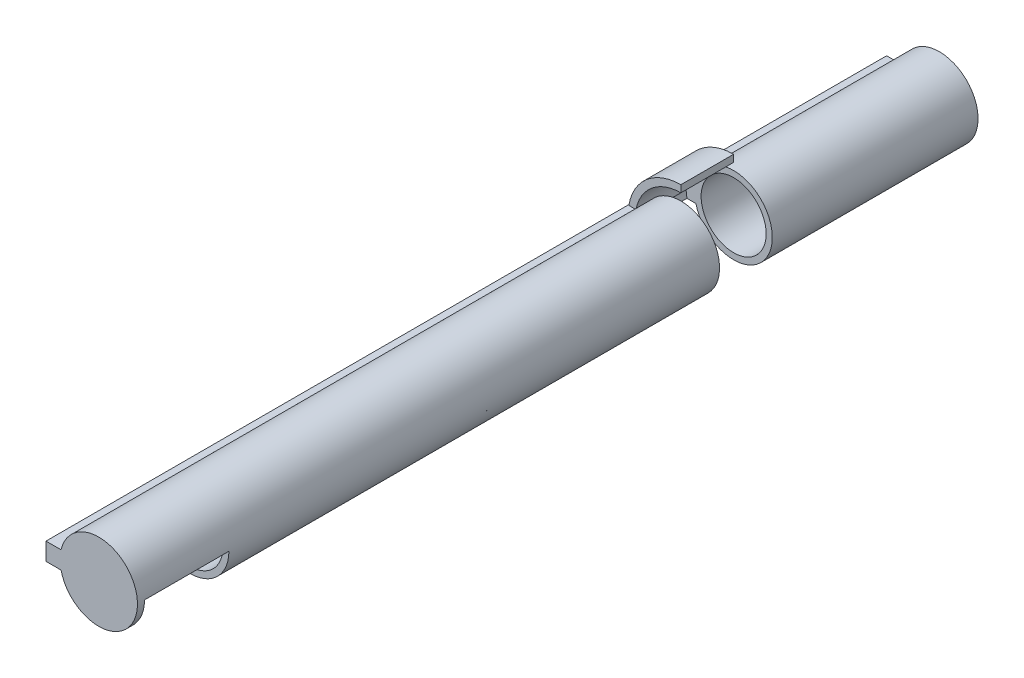
ISO-10303-21;
HEADER;
FILE_DESCRIPTION(('STEP AP214'),'2;1');
FILE_NAME('part.step','',(''),(''),'','','');
FILE_SCHEMA(('AUTOMOTIVE_DESIGN { 1 0 10303 214 1 1 1 1 }'));
ENDSEC;
DATA;
#1=APPLICATION_CONTEXT('core data for automotive mechanical design processes');
#2=APPLICATION_PROTOCOL_DEFINITION('international standard','automotive_design',2000,#1);
#3=PRODUCT_CONTEXT('',#1,'mechanical');
#4=PRODUCT('Part','Part','',(#3));
#5=PRODUCT_RELATED_PRODUCT_CATEGORY('part','',(#4));
#6=PRODUCT_DEFINITION_FORMATION('','',#4);
#7=PRODUCT_DEFINITION_CONTEXT('part definition',#1,'design');
#8=PRODUCT_DEFINITION('design','',#6,#7);
#9=PRODUCT_DEFINITION_SHAPE('','',#8);
#10=(LENGTH_UNIT() NAMED_UNIT(*) SI_UNIT(.MILLI.,.METRE.));
#11=(NAMED_UNIT(*) PLANE_ANGLE_UNIT() SI_UNIT($,.RADIAN.));
#12=(NAMED_UNIT(*) SI_UNIT($,.STERADIAN.) SOLID_ANGLE_UNIT());
#13=UNCERTAINTY_MEASURE_WITH_UNIT(LENGTH_MEASURE(1.E-05),#10,'distance_accuracy_value','');
#14=(GEOMETRIC_REPRESENTATION_CONTEXT(3) GLOBAL_UNCERTAINTY_ASSIGNED_CONTEXT((#13)) GLOBAL_UNIT_ASSIGNED_CONTEXT((#10,
#11,#12)) REPRESENTATION_CONTEXT('',''));
#15=CARTESIAN_POINT('',(0.,0.,0.));
#16=DIRECTION('',(0.,0.,1.));
#17=DIRECTION('',(1.,0.,0.));
#18=AXIS2_PLACEMENT_3D('',#15,#16,#17);
#19=CARTESIAN_POINT('',(0.,0.,213.));
#20=DIRECTION('',(0.,0.,1.));
#21=DIRECTION('',(1.,0.,0.));
#22=AXIS2_PLACEMENT_3D('',#19,#20,#21);
#23=PLANE('',#22);
#24=CARTESIAN_POINT('',(0.,0.,213.));
#25=DIRECTION('',(0.,0.,1.));
#26=DIRECTION('',(1.,0.,0.));
#27=AXIS2_PLACEMENT_3D('',#24,#25,#26);
#28=CIRCLE('',#27,6.5);
#29=CARTESIAN_POINT('',(5.61707828518173,3.27084569158189,213.));
#30=VERTEX_POINT('',#29);
#31=CARTESIAN_POINT('',(-3.2708456915819,-5.61707828518173,213.));
#32=VERTEX_POINT('',#31);
#33=EDGE_CURVE('E172',#30,#32,#28,.T.);
#34=ORIENTED_EDGE('',*,*,#33,.F.);
#35=CARTESIAN_POINT('',(12.5304054054054,7.29650192737499,213.));
#36=DIRECTION('',(0.,0.,1.));
#37=DIRECTION('',(1.,0.,0.));
#38=AXIS2_PLACEMENT_3D('',#35,#36,#37);
#39=CIRCLE('',#38,8.);
#40=CARTESIAN_POINT('',(9.25,0.,213.));
#41=VERTEX_POINT('',#40);
#42=EDGE_CURVE('E11',#30,#41,#39,.T.);
#43=ORIENTED_EDGE('',*,*,#42,.T.);
#44=CARTESIAN_POINT('',(0.,0.,213.));
#45=DIRECTION('',(0.,0.,1.));
#46=DIRECTION('',(1.,0.,0.));
#47=AXIS2_PLACEMENT_3D('',#44,#45,#46);
#48=CIRCLE('',#47,9.25);
#49=CARTESIAN_POINT('',(0.,-9.25,213.));
#50=VERTEX_POINT('',#49);
#51=EDGE_CURVE('E170',#41,#50,#48,.T.);
#52=ORIENTED_EDGE('',*,*,#51,.T.);
#53=CARTESIAN_POINT('',(-7.296501927375,-12.5304054054054,213.));
#54=DIRECTION('',(0.,0.,1.));
#55=DIRECTION('',(1.,0.,0.));
#56=AXIS2_PLACEMENT_3D('',#53,#54,#55);
#57=CIRCLE('',#56,8.);
#58=EDGE_CURVE('E42',#50,#32,#57,.T.);
#59=ORIENTED_EDGE('',*,*,#58,.T.);
#60=EDGE_LOOP('',(#34,#43,#52,#59));
#61=FACE_BOUND('',#60,.T.);
#62=ADVANCED_FACE('F34',(#61),#23,.T.);
#63=CARTESIAN_POINT('',(0.,0.,210.));
#64=DIRECTION('',(0.,0.,-1.));
#65=DIRECTION('',(-1.,0.,0.));
#66=AXIS2_PLACEMENT_3D('',#63,#64,#65);
#67=CYLINDRICAL_SURFACE('',#66,11.);
#68=CARTESIAN_POINT('',(0.,0.,58.5));
#69=DIRECTION('',(0.,0.,1.));
#70=DIRECTION('',(1.,0.,0.));
#71=AXIS2_PLACEMENT_3D('',#68,#69,#70);
#72=CIRCLE('',#71,11.);
#73=CARTESIAN_POINT('',(-10.7121426428143,-2.5,58.5));
#74=VERTEX_POINT('',#73);
#75=CARTESIAN_POINT('',(-10.7121426428143,2.5,58.5));
#76=VERTEX_POINT('',#75);
#77=EDGE_CURVE('E270',#74,#76,#72,.T.);
#78=ORIENTED_EDGE('',*,*,#77,.F.);
#79=DIRECTION('',(0.,0.,-1.));
#80=VECTOR('',#79,1.);
#81=CARTESIAN_POINT('',(-10.7121426428143,-2.5,245.58678379147));
#82=LINE('',#81,#80);
#83=CARTESIAN_POINT('',(-10.7121426428143,-2.5,0.));
#84=VERTEX_POINT('',#83);
#85=EDGE_CURVE('E283',#74,#84,#82,.T.);
#86=ORIENTED_EDGE('',*,*,#85,.T.);
#87=CARTESIAN_POINT('',(0.,0.,0.));
#88=DIRECTION('',(0.,0.,1.));
#89=DIRECTION('',(1.,0.,0.));
#90=AXIS2_PLACEMENT_3D('',#87,#88,#89);
#91=CIRCLE('',#90,11.);
#92=CARTESIAN_POINT('',(-10.7121426428143,2.5,0.));
#93=VERTEX_POINT('',#92);
#94=EDGE_CURVE('E198',#84,#93,#91,.T.);
#95=ORIENTED_EDGE('',*,*,#94,.T.);
#96=DIRECTION('',(0.,0.,-1.));
#97=VECTOR('',#96,1.);
#98=CARTESIAN_POINT('',(-10.7121426428143,2.5,245.58678379147));
#99=LINE('',#98,#97);
#100=EDGE_CURVE('E279',#76,#93,#99,.T.);
#101=ORIENTED_EDGE('',*,*,#100,.F.);
#102=EDGE_LOOP('',(#78,#86,#95,#101));
#103=FACE_BOUND('',#102,.T.);
#104=ADVANCED_FACE('F407',(#103),#67,.T.);
#105=CARTESIAN_POINT('',(0.,0.,210.));
#106=DIRECTION('',(0.,0.,-1.));
#107=DIRECTION('',(-1.,0.,0.));
#108=AXIS2_PLACEMENT_3D('',#105,#106,#107);
#109=CYLINDRICAL_SURFACE('',#108,9.25);
#110=CARTESIAN_POINT('',(0.,0.,0.));
#111=DIRECTION('',(0.,0.,1.));
#112=DIRECTION('',(1.,0.,0.));
#113=AXIS2_PLACEMENT_3D('',#110,#111,#112);
#114=CIRCLE('',#113,9.25);
#115=CARTESIAN_POINT('',(9.25,0.,0.));
#116=VERTEX_POINT('',#115);
#117=EDGE_CURVE('E331',#116,#116,#114,.T.);
#118=ORIENTED_EDGE('',*,*,#117,.F.);
#119=EDGE_LOOP('',(#118));
#120=FACE_BOUND('',#119,.T.);
#121=CARTESIAN_POINT('',(0.,0.,58.5));
#122=DIRECTION('',(0.,0.,1.));
#123=DIRECTION('',(1.,0.,0.));
#124=AXIS2_PLACEMENT_3D('',#121,#122,#123);
#125=CIRCLE('',#124,9.25);
#126=CARTESIAN_POINT('',(9.25,0.,58.5));
#127=VERTEX_POINT('',#126);
#128=EDGE_CURVE('E276',#127,#127,#125,.T.);
#129=ORIENTED_EDGE('',*,*,#128,.T.);
#130=EDGE_LOOP('',(#129));
#131=FACE_BOUND('',#130,.T.);
#132=ADVANCED_FACE('F436',(#120,#131),#109,.F.);
#133=CARTESIAN_POINT('',(-11.,2.5,245.58678379147));
#134=DIRECTION('',(0.,-1.,0.));
#135=DIRECTION('',(0.,0.,-1.));
#136=AXIS2_PLACEMENT_3D('',#133,#134,#135);
#137=PLANE('',#136);
#138=DIRECTION('',(0.,0.,1.));
#139=VECTOR('',#138,1.);
#140=CARTESIAN_POINT('',(-14.790199457749,2.5,58.5));
#141=LINE('',#140,#139);
#142=CARTESIAN_POINT('',(-14.790199457749,2.5,73.5));
#143=VERTEX_POINT('',#142);
#144=CARTESIAN_POINT('',(-14.790199457749,2.5,58.5));
#145=VERTEX_POINT('',#144);
#146=EDGE_CURVE('E253',#143,#145,#141,.F.);
#147=ORIENTED_EDGE('',*,*,#146,.T.);
#148=DIRECTION('',(-1.,0.,0.));
#149=VECTOR('',#148,1.);
#150=CARTESIAN_POINT('',(-11.,2.5,58.5));
#151=LINE('',#150,#149);
#152=CARTESIAN_POINT('',(-12.7573508221731,2.5,58.5));
#153=VERTEX_POINT('',#152);
#154=EDGE_CURVE('E272',#153,#145,#151,.T.);
#155=ORIENTED_EDGE('',*,*,#154,.F.);
#156=EDGE_CURVE('E273',#76,#153,#151,.T.);
#157=ORIENTED_EDGE('',*,*,#156,.F.);
#158=ORIENTED_EDGE('',*,*,#100,.T.);
#159=DIRECTION('',(-1.,0.,0.));
#160=VECTOR('',#159,1.);
#161=CARTESIAN_POINT('',(-11.,2.5,0.));
#162=LINE('',#161,#160);
#163=CARTESIAN_POINT('',(-15.,2.5,0.));
#164=VERTEX_POINT('',#163);
#165=EDGE_CURVE('E289',#93,#164,#162,.T.);
#166=ORIENTED_EDGE('',*,*,#165,.T.);
#167=DIRECTION('',(0.,0.,-1.));
#168=VECTOR('',#167,1.);
#169=CARTESIAN_POINT('',(-15.,2.5,245.58678379147));
#170=LINE('',#169,#168);
#171=CARTESIAN_POINT('',(-15.,2.5,239.));
#172=VERTEX_POINT('',#171);
#173=EDGE_CURVE('E288',#172,#164,#170,.T.);
#174=ORIENTED_EDGE('',*,*,#173,.F.);
#175=DIRECTION('',(-1.,0.,0.));
#176=VECTOR('',#175,1.);
#177=CARTESIAN_POINT('',(-11.,2.5,239.));
#178=LINE('',#177,#176);
#179=CARTESIAN_POINT('',(-10.7121426428143,2.5,239.));
#180=VERTEX_POINT('',#179);
#181=EDGE_CURVE('E299',#180,#172,#178,.T.);
#182=ORIENTED_EDGE('',*,*,#181,.F.);
#183=CARTESIAN_POINT('',(-10.7121426428143,2.5,73.5));
#184=VERTEX_POINT('',#183);
#185=EDGE_CURVE('E292',#180,#184,#99,.T.);
#186=ORIENTED_EDGE('',*,*,#185,.T.);
#187=DIRECTION('',(-1.,0.,0.));
#188=VECTOR('',#187,1.);
#189=CARTESIAN_POINT('',(-11.,2.5,73.5));
#190=LINE('',#189,#188);
#191=CARTESIAN_POINT('',(-12.7573508221731,2.5,73.5));
#192=VERTEX_POINT('',#191);
#193=EDGE_CURVE('E264',#184,#192,#190,.T.);
#194=ORIENTED_EDGE('',*,*,#193,.T.);
#195=EDGE_CURVE('E263',#192,#143,#190,.T.);
#196=ORIENTED_EDGE('',*,*,#195,.T.);
#197=EDGE_LOOP('',(#147,#155,#157,#158,#166,#174,#182,#186,#194,#196));
#198=FACE_BOUND('',#197,.T.);
#199=ADVANCED_FACE('F376',(#198),#137,.F.);
#200=CARTESIAN_POINT('',(-11.,-2.5,245.58678379147));
#201=DIRECTION('',(0.,1.,0.));
#202=DIRECTION('',(0.,0.,1.));
#203=AXIS2_PLACEMENT_3D('',#200,#201,#202);
#204=PLANE('',#203);
#205=DIRECTION('',(1.,0.,0.));
#206=VECTOR('',#205,1.);
#207=CARTESIAN_POINT('',(-11.,-2.5,58.5));
#208=LINE('',#207,#206);
#209=CARTESIAN_POINT('',(-13.2664991614216,-2.5,58.5));
#210=VERTEX_POINT('',#209);
#211=EDGE_CURVE('E343',#210,#74,#208,.T.);
#212=ORIENTED_EDGE('',*,*,#211,.F.);
#213=DIRECTION('',(0.,0.,1.));
#214=VECTOR('',#213,1.);
#215=CARTESIAN_POINT('',(-13.2664991614216,-2.5,58.5));
#216=LINE('',#215,#214);
#217=CARTESIAN_POINT('',(-13.2664991614216,-2.5,73.5));
#218=VERTEX_POINT('',#217);
#219=EDGE_CURVE('E340',#210,#218,#216,.T.);
#220=ORIENTED_EDGE('',*,*,#219,.T.);
#221=DIRECTION('',(1.,0.,0.));
#222=VECTOR('',#221,1.);
#223=CARTESIAN_POINT('',(-11.,-2.5,73.5));
#224=LINE('',#223,#222);
#225=CARTESIAN_POINT('',(-10.7121426428143,-2.5,73.5));
#226=VERTEX_POINT('',#225);
#227=EDGE_CURVE('E197',#218,#226,#224,.T.);
#228=ORIENTED_EDGE('',*,*,#227,.T.);
#229=CARTESIAN_POINT('',(-10.7121426428143,-2.5,239.));
#230=VERTEX_POINT('',#229);
#231=EDGE_CURVE('E302',#230,#226,#82,.T.);
#232=ORIENTED_EDGE('',*,*,#231,.F.);
#233=DIRECTION('',(1.,0.,0.));
#234=VECTOR('',#233,1.);
#235=CARTESIAN_POINT('',(-11.,-2.5,239.));
#236=LINE('',#235,#234);
#237=CARTESIAN_POINT('',(-15.,-2.5,239.));
#238=VERTEX_POINT('',#237);
#239=EDGE_CURVE('E293',#238,#230,#236,.T.);
#240=ORIENTED_EDGE('',*,*,#239,.F.);
#241=DIRECTION('',(0.,0.,-1.));
#242=VECTOR('',#241,1.);
#243=CARTESIAN_POINT('',(-15.,-2.5,245.58678379147));
#244=LINE('',#243,#242);
#245=CARTESIAN_POINT('',(-15.,-2.5,0.));
#246=VERTEX_POINT('',#245);
#247=EDGE_CURVE('E284',#238,#246,#244,.T.);
#248=ORIENTED_EDGE('',*,*,#247,.T.);
#249=DIRECTION('',(1.,0.,0.));
#250=VECTOR('',#249,1.);
#251=CARTESIAN_POINT('',(-11.,-2.5,0.));
#252=LINE('',#251,#250);
#253=EDGE_CURVE('E280',#246,#84,#252,.T.);
#254=ORIENTED_EDGE('',*,*,#253,.T.);
#255=ORIENTED_EDGE('',*,*,#85,.F.);
#256=EDGE_LOOP('',(#212,#220,#228,#232,#240,#248,#254,#255));
#257=FACE_BOUND('',#256,.T.);
#258=ADVANCED_FACE('F388',(#257),#204,.F.);
#259=DIRECTION('',(0.,0.,-1.));
#260=VECTOR('',#259,1.);
#261=CARTESIAN_POINT('',(11.,0.,237.));
#262=LINE('',#261,#260);
#263=CARTESIAN_POINT('',(11.,0.,237.));
#264=VERTEX_POINT('',#263);
#265=CARTESIAN_POINT('',(11.,0.,213.));
#266=VERTEX_POINT('',#265);
#267=EDGE_CURVE('E213',#264,#266,#262,.T.);
#268=ORIENTED_EDGE('',*,*,#267,.T.);
#269=CARTESIAN_POINT('',(0.,0.,213.));
#270=DIRECTION('',(0.,0.,1.));
#271=DIRECTION('',(1.,0.,0.));
#272=AXIS2_PLACEMENT_3D('',#269,#270,#271);
#273=CIRCLE('',#272,11.);
#274=CARTESIAN_POINT('',(0.,-11.,213.));
#275=VERTEX_POINT('',#274);
#276=EDGE_CURVE('E193',#275,#266,#273,.T.);
#277=ORIENTED_EDGE('',*,*,#276,.F.);
#278=DIRECTION('',(0.,0.,-1.));
#279=VECTOR('',#278,1.);
#280=CARTESIAN_POINT('',(0.,-11.,237.));
#281=LINE('',#280,#279);
#282=CARTESIAN_POINT('',(0.,-11.,237.));
#283=VERTEX_POINT('',#282);
#284=EDGE_CURVE('E328',#283,#275,#281,.T.);
#285=ORIENTED_EDGE('',*,*,#284,.F.);
#286=CARTESIAN_POINT('',(0.,0.,237.));
#287=DIRECTION('',(0.,0.,1.));
#288=DIRECTION('',(1.,0.,0.));
#289=AXIS2_PLACEMENT_3D('',#286,#287,#288);
#290=CIRCLE('',#289,11.);
#291=EDGE_CURVE('E295',#283,#264,#290,.T.);
#292=ORIENTED_EDGE('',*,*,#291,.T.);
#293=EDGE_LOOP('',(#268,#277,#285,#292));
#294=FACE_BOUND('',#293,.T.);
#295=ORIENTED_EDGE('',*,*,#231,.T.);
#296=CARTESIAN_POINT('',(0.,0.,73.5));
#297=DIRECTION('',(0.,0.,1.));
#298=DIRECTION('',(1.,0.,0.));
#299=AXIS2_PLACEMENT_3D('',#296,#297,#298);
#300=CIRCLE('',#299,11.);
#301=EDGE_CURVE('E259',#226,#184,#300,.T.);
#302=ORIENTED_EDGE('',*,*,#301,.T.);
#303=ORIENTED_EDGE('',*,*,#185,.F.);
#304=CARTESIAN_POINT('',(0.,0.,239.));
#305=DIRECTION('',(0.,0.,1.));
#306=DIRECTION('',(1.,0.,0.));
#307=AXIS2_PLACEMENT_3D('',#304,#305,#306);
#308=CIRCLE('',#307,11.);
#309=EDGE_CURVE('E309',#230,#180,#308,.T.);
#310=ORIENTED_EDGE('',*,*,#309,.F.);
#311=EDGE_LOOP('',(#295,#302,#303,#310));
#312=FACE_BOUND('',#311,.T.);
#313=ADVANCED_FACE('F383',(#294,#312),#67,.T.);
#314=CARTESIAN_POINT('',(0.,0.,73.5));
#315=DIRECTION('',(0.,0.,1.));
#316=DIRECTION('',(1.,0.,0.));
#317=AXIS2_PLACEMENT_3D('',#314,#315,#316);
#318=CIRCLE('',#317,9.25);
#319=CARTESIAN_POINT('',(9.25,0.,73.5));
#320=VERTEX_POINT('',#319);
#321=EDGE_CURVE('E267',#320,#320,#318,.T.);
#322=ORIENTED_EDGE('',*,*,#321,.F.);
#323=EDGE_LOOP('',(#322));
#324=FACE_BOUND('',#323,.T.);
#325=CARTESIAN_POINT('',(0.,0.,210.));
#326=DIRECTION('',(0.,0.,1.));
#327=DIRECTION('',(1.,0.,0.));
#328=AXIS2_PLACEMENT_3D('',#325,#326,#327);
#329=CIRCLE('',#328,9.25);
#330=CARTESIAN_POINT('',(9.25,0.,210.));
#331=VERTEX_POINT('',#330);
#332=CARTESIAN_POINT('',(0.,-9.25,210.));
#333=VERTEX_POINT('',#332);
#334=EDGE_CURVE('E332',#331,#333,#329,.T.);
#335=ORIENTED_EDGE('',*,*,#334,.T.);
#336=DIRECTION('',(0.,0.,-1.));
#337=VECTOR('',#336,1.);
#338=CARTESIAN_POINT('',(0.,-9.25,226.081475451951));
#339=LINE('',#338,#337);
#340=EDGE_CURVE('E186',#50,#333,#339,.T.);
#341=ORIENTED_EDGE('',*,*,#340,.F.);
#342=CARTESIAN_POINT('',(0.,0.,213.));
#343=DIRECTION('',(0.,0.,1.));
#344=DIRECTION('',(1.,0.,0.));
#345=AXIS2_PLACEMENT_3D('',#342,#343,#344);
#346=CIRCLE('',#345,9.25);
#347=EDGE_CURVE('E179',#41,#50,#346,.F.);
#348=ORIENTED_EDGE('',*,*,#347,.F.);
#349=DIRECTION('',(0.,0.,-1.));
#350=VECTOR('',#349,1.);
#351=CARTESIAN_POINT('',(9.25,0.,226.081475451951));
#352=LINE('',#351,#350);
#353=EDGE_CURVE('E183',#41,#331,#352,.T.);
#354=ORIENTED_EDGE('',*,*,#353,.T.);
#355=EDGE_LOOP('',(#335,#341,#348,#354));
#356=FACE_BOUND('',#355,.T.);
#357=ADVANCED_FACE('F182',(#324,#356),#109,.F.);
#358=CARTESIAN_POINT('',(0.,0.,0.));
#359=DIRECTION('',(0.,0.,1.));
#360=DIRECTION('',(1.,0.,0.));
#361=AXIS2_PLACEMENT_3D('',#358,#359,#360);
#362=PLANE('',#361);
#363=ORIENTED_EDGE('',*,*,#165,.F.);
#364=ORIENTED_EDGE('',*,*,#94,.F.);
#365=ORIENTED_EDGE('',*,*,#253,.F.);
#366=DIRECTION('',(0.,-1.,0.));
#367=VECTOR('',#366,1.);
#368=CARTESIAN_POINT('',(-15.,2.5,0.));
#369=LINE('',#368,#367);
#370=EDGE_CURVE('E285',#164,#246,#369,.T.);
#371=ORIENTED_EDGE('',*,*,#370,.F.);
#372=EDGE_LOOP('',(#363,#364,#365,#371));
#373=FACE_BOUND('',#372,.T.);
#374=ORIENTED_EDGE('',*,*,#117,.T.);
#375=EDGE_LOOP('',(#374));
#376=FACE_BOUND('',#375,.T.);
#377=ADVANCED_FACE('F412',(#373,#376),#362,.F.);
#378=ORIENTED_EDGE('',*,*,#51,.F.);
#379=DIRECTION('',(0.,0.,-1.));
#380=VECTOR('',#379,1.);
#381=CARTESIAN_POINT('',(9.25,0.,237.));
#382=LINE('',#381,#380);
#383=CARTESIAN_POINT('',(9.25,0.,237.));
#384=VERTEX_POINT('',#383);
#385=EDGE_CURVE('E204',#384,#41,#382,.T.);
#386=ORIENTED_EDGE('',*,*,#385,.F.);
#387=CARTESIAN_POINT('',(0.,0.,237.));
#388=DIRECTION('',(0.,0.,-1.));
#389=DIRECTION('',(-1.,0.,0.));
#390=AXIS2_PLACEMENT_3D('',#387,#388,#389);
#391=CIRCLE('',#390,9.25);
#392=CARTESIAN_POINT('',(0.,-9.25,237.));
#393=VERTEX_POINT('',#392);
#394=EDGE_CURVE('E323',#393,#384,#391,.T.);
#395=ORIENTED_EDGE('',*,*,#394,.F.);
#396=DIRECTION('',(0.,0.,-1.));
#397=VECTOR('',#396,1.);
#398=CARTESIAN_POINT('',(0.,-9.25,237.));
#399=LINE('',#398,#397);
#400=EDGE_CURVE('E206',#393,#50,#399,.T.);
#401=ORIENTED_EDGE('',*,*,#400,.T.);
#402=EDGE_LOOP('',(#378,#386,#395,#401));
#403=FACE_BOUND('',#402,.T.);
#404=ADVANCED_FACE('F202',(#403),#109,.F.);
#405=CARTESIAN_POINT('',(0.,-9.25,237.));
#406=DIRECTION('',(-1.,0.,0.));
#407=DIRECTION('',(0.,-1.,0.));
#408=AXIS2_PLACEMENT_3D('',#405,#406,#407);
#409=PLANE('',#408);
#410=ORIENTED_EDGE('',*,*,#284,.T.);
#411=DIRECTION('',(0.,1.,0.));
#412=VECTOR('',#411,1.);
#413=CARTESIAN_POINT('',(0.,-9.25,213.));
#414=LINE('',#413,#412);
#415=EDGE_CURVE('E207',#275,#50,#414,.T.);
#416=ORIENTED_EDGE('',*,*,#415,.T.);
#417=ORIENTED_EDGE('',*,*,#400,.F.);
#418=DIRECTION('',(0.,1.,0.));
#419=VECTOR('',#418,1.);
#420=CARTESIAN_POINT('',(0.,-9.25,237.));
#421=LINE('',#420,#419);
#422=EDGE_CURVE('E320',#283,#393,#421,.T.);
#423=ORIENTED_EDGE('',*,*,#422,.F.);
#424=EDGE_LOOP('',(#410,#416,#417,#423));
#425=FACE_BOUND('',#424,.T.);
#426=ADVANCED_FACE('F445',(#425),#409,.F.);
#427=CARTESIAN_POINT('',(9.25,0.,237.));
#428=DIRECTION('',(0.,1.,0.));
#429=DIRECTION('',(0.,0.,1.));
#430=AXIS2_PLACEMENT_3D('',#427,#428,#429);
#431=PLANE('',#430);
#432=ORIENTED_EDGE('',*,*,#385,.T.);
#433=DIRECTION('',(1.,0.,0.));
#434=VECTOR('',#433,1.);
#435=CARTESIAN_POINT('',(9.25,0.,213.));
#436=LINE('',#435,#434);
#437=EDGE_CURVE('E190',#41,#266,#436,.T.);
#438=ORIENTED_EDGE('',*,*,#437,.T.);
#439=ORIENTED_EDGE('',*,*,#267,.F.);
#440=DIRECTION('',(1.,0.,0.));
#441=VECTOR('',#440,1.);
#442=CARTESIAN_POINT('',(9.25,0.,237.));
#443=LINE('',#442,#441);
#444=EDGE_CURVE('E211',#384,#264,#443,.T.);
#445=ORIENTED_EDGE('',*,*,#444,.F.);
#446=EDGE_LOOP('',(#432,#438,#439,#445));
#447=FACE_BOUND('',#446,.T.);
#448=ADVANCED_FACE('F209',(#447),#431,.F.);
#449=ORIENTED_EDGE('',*,*,#347,.T.);
#450=ORIENTED_EDGE('',*,*,#415,.F.);
#451=ORIENTED_EDGE('',*,*,#276,.T.);
#452=ORIENTED_EDGE('',*,*,#437,.F.);
#453=EDGE_LOOP('',(#449,#450,#451,#452));
#454=FACE_BOUND('',#453,.T.);
#455=ADVANCED_FACE('F191',(#454),#23,.T.);
#456=CARTESIAN_POINT('',(0.,0.,210.));
#457=DIRECTION('',(0.,0.,1.));
#458=DIRECTION('',(1.,0.,0.));
#459=AXIS2_PLACEMENT_3D('',#456,#457,#458);
#460=PLANE('',#459);
#461=ORIENTED_EDGE('',*,*,#334,.F.);
#462=CARTESIAN_POINT('',(12.5304054054054,7.29650192737499,210.));
#463=DIRECTION('',(0.,0.,1.));
#464=DIRECTION('',(1.,0.,0.));
#465=AXIS2_PLACEMENT_3D('',#462,#463,#464);
#466=CIRCLE('',#465,8.);
#467=CARTESIAN_POINT('',(5.61707828518173,3.27084569158189,210.));
#468=VERTEX_POINT('',#467);
#469=EDGE_CURVE('E216',#331,#468,#466,.F.);
#470=ORIENTED_EDGE('',*,*,#469,.T.);
#471=CARTESIAN_POINT('',(0.,0.,210.));
#472=DIRECTION('',(0.,0.,1.));
#473=DIRECTION('',(1.,0.,0.));
#474=AXIS2_PLACEMENT_3D('',#471,#472,#473);
#475=CIRCLE('',#474,6.5);
#476=CARTESIAN_POINT('',(-3.27084569158189,-5.61707828518173,210.));
#477=VERTEX_POINT('',#476);
#478=EDGE_CURVE('E312',#468,#477,#475,.T.);
#479=ORIENTED_EDGE('',*,*,#478,.T.);
#480=CARTESIAN_POINT('',(-7.296501927375,-12.5304054054054,210.));
#481=DIRECTION('',(0.,0.,1.));
#482=DIRECTION('',(1.,0.,0.));
#483=AXIS2_PLACEMENT_3D('',#480,#481,#482);
#484=CIRCLE('',#483,8.);
#485=EDGE_CURVE('E348',#477,#333,#484,.F.);
#486=ORIENTED_EDGE('',*,*,#485,.T.);
#487=EDGE_LOOP('',(#461,#470,#479,#486));
#488=FACE_BOUND('',#487,.T.);
#489=ADVANCED_FACE('F358',(#488),#460,.F.);
#490=CARTESIAN_POINT('',(0.,0.,213.));
#491=DIRECTION('',(0.,0.,-1.));
#492=DIRECTION('',(-1.,0.,0.));
#493=AXIS2_PLACEMENT_3D('',#490,#491,#492);
#494=CYLINDRICAL_SURFACE('',#493,6.5);
#495=ORIENTED_EDGE('',*,*,#478,.F.);
#496=DIRECTION('',(0.,0.,-1.));
#497=VECTOR('',#496,1.);
#498=CARTESIAN_POINT('',(5.61707828518173,3.27084569158189,213.));
#499=LINE('',#498,#497);
#500=EDGE_CURVE('E55',#468,#30,#499,.F.);
#501=ORIENTED_EDGE('',*,*,#500,.T.);
#502=ORIENTED_EDGE('',*,*,#33,.T.);
#503=DIRECTION('',(0.,0.,-1.));
#504=VECTOR('',#503,1.);
#505=CARTESIAN_POINT('',(-3.2708456915819,-5.61707828518173,213.));
#506=LINE('',#505,#504);
#507=EDGE_CURVE('E351',#32,#477,#506,.T.);
#508=ORIENTED_EDGE('',*,*,#507,.T.);
#509=EDGE_LOOP('',(#495,#501,#502,#508));
#510=FACE_BOUND('',#509,.T.);
#511=ADVANCED_FACE('F354',(#510),#494,.F.);
#512=CARTESIAN_POINT('',(0.,0.,237.));
#513=DIRECTION('',(0.,0.,1.));
#514=DIRECTION('',(1.,0.,0.));
#515=AXIS2_PLACEMENT_3D('',#512,#513,#514);
#516=PLANE('',#515);
#517=ORIENTED_EDGE('',*,*,#291,.F.);
#518=ORIENTED_EDGE('',*,*,#422,.T.);
#519=ORIENTED_EDGE('',*,*,#394,.T.);
#520=ORIENTED_EDGE('',*,*,#444,.T.);
#521=EDGE_LOOP('',(#517,#518,#519,#520));
#522=FACE_BOUND('',#521,.T.);
#523=ADVANCED_FACE('F427',(#522),#516,.F.);
#524=CARTESIAN_POINT('',(0.,0.,239.));
#525=DIRECTION('',(0.,0.,1.));
#526=DIRECTION('',(1.,0.,0.));
#527=AXIS2_PLACEMENT_3D('',#524,#525,#526);
#528=PLANE('',#527);
#529=ORIENTED_EDGE('',*,*,#309,.T.);
#530=ORIENTED_EDGE('',*,*,#181,.T.);
#531=DIRECTION('',(0.,-1.,0.));
#532=VECTOR('',#531,1.);
#533=CARTESIAN_POINT('',(-15.,2.5,239.));
#534=LINE('',#533,#532);
#535=EDGE_CURVE('E296',#172,#238,#534,.T.);
#536=ORIENTED_EDGE('',*,*,#535,.T.);
#537=ORIENTED_EDGE('',*,*,#239,.T.);
#538=EDGE_LOOP('',(#529,#530,#536,#537));
#539=FACE_BOUND('',#538,.T.);
#540=ADVANCED_FACE('F418',(#539),#528,.T.);
#541=CARTESIAN_POINT('',(-15.,2.5,245.58678379147));
#542=DIRECTION('',(1.,0.,0.));
#543=DIRECTION('',(0.,0.,-1.));
#544=AXIS2_PLACEMENT_3D('',#541,#542,#543);
#545=PLANE('',#544);
#546=ORIENTED_EDGE('',*,*,#535,.F.);
#547=ORIENTED_EDGE('',*,*,#173,.T.);
#548=ORIENTED_EDGE('',*,*,#370,.T.);
#549=ORIENTED_EDGE('',*,*,#247,.F.);
#550=EDGE_LOOP('',(#546,#547,#548,#549));
#551=FACE_BOUND('',#550,.T.);
#552=ADVANCED_FACE('F419',(#551),#545,.F.);
#553=CARTESIAN_POINT('',(0.,0.,58.5));
#554=DIRECTION('',(0.,0.,1.));
#555=DIRECTION('',(1.,0.,0.));
#556=AXIS2_PLACEMENT_3D('',#553,#554,#555);
#557=CYLINDRICAL_SURFACE('',#556,13.5);
#558=CARTESIAN_POINT('',(0.,0.,58.5));
#559=DIRECTION('',(0.,0.,1.));
#560=DIRECTION('',(1.,0.,0.));
#561=AXIS2_PLACEMENT_3D('',#558,#559,#560);
#562=CIRCLE('',#561,13.5);
#563=CARTESIAN_POINT('',(-13.5,0.,58.5));
#564=VERTEX_POINT('',#563);
#565=EDGE_CURVE('E257',#564,#210,#562,.T.);
#566=ORIENTED_EDGE('',*,*,#565,.F.);
#567=DIRECTION('',(0.,0.,1.));
#568=VECTOR('',#567,1.);
#569=CARTESIAN_POINT('',(-13.5,0.,58.5));
#570=LINE('',#569,#568);
#571=CARTESIAN_POINT('',(-13.5,0.,73.5));
#572=VERTEX_POINT('',#571);
#573=EDGE_CURVE('E246',#564,#572,#570,.T.);
#574=ORIENTED_EDGE('',*,*,#573,.T.);
#575=CARTESIAN_POINT('',(0.,0.,73.5));
#576=DIRECTION('',(0.,0.,1.));
#577=DIRECTION('',(1.,0.,0.));
#578=AXIS2_PLACEMENT_3D('',#575,#576,#577);
#579=CIRCLE('',#578,13.5);
#580=EDGE_CURVE('E256',#572,#218,#579,.T.);
#581=ORIENTED_EDGE('',*,*,#580,.T.);
#582=ORIENTED_EDGE('',*,*,#219,.F.);
#583=EDGE_LOOP('',(#566,#574,#581,#582));
#584=FACE_BOUND('',#583,.T.);
#585=ADVANCED_FACE('F394',(#584),#557,.F.);
#586=CARTESIAN_POINT('',(0.,0.,58.5));
#587=DIRECTION('',(0.,0.,1.));
#588=DIRECTION('',(1.,0.,0.));
#589=AXIS2_PLACEMENT_3D('',#586,#587,#588);
#590=PLANE('',#589);
#591=CARTESIAN_POINT('',(0.,0.,58.5));
#592=DIRECTION('',(0.,0.,-1.));
#593=DIRECTION('',(-1.,0.,0.));
#594=AXIS2_PLACEMENT_3D('',#591,#592,#593);
#595=CIRCLE('',#594,13.);
#596=CARTESIAN_POINT('',(-13.,0.,58.5));
#597=VERTEX_POINT('',#596);
#598=EDGE_CURVE('E220',#597,#153,#595,.T.);
#599=ORIENTED_EDGE('',*,*,#598,.F.);
#600=DIRECTION('',(1.,0.,0.));
#601=VECTOR('',#600,1.);
#602=CARTESIAN_POINT('',(-15.,0.,58.5));
#603=LINE('',#602,#601);
#604=EDGE_CURVE('E230',#564,#597,#603,.T.);
#605=ORIENTED_EDGE('',*,*,#604,.F.);
#606=ORIENTED_EDGE('',*,*,#565,.T.);
#607=ORIENTED_EDGE('',*,*,#211,.T.);
#608=ORIENTED_EDGE('',*,*,#77,.T.);
#609=ORIENTED_EDGE('',*,*,#156,.T.);
#610=EDGE_LOOP('',(#599,#605,#606,#607,#608,#609));
#611=FACE_BOUND('',#610,.T.);
#612=ORIENTED_EDGE('',*,*,#128,.F.);
#613=EDGE_LOOP('',(#612));
#614=FACE_BOUND('',#613,.T.);
#615=ADVANCED_FACE('F401',(#611,#614),#590,.T.);
#616=CARTESIAN_POINT('',(0.,0.,73.5));
#617=DIRECTION('',(0.,0.,1.));
#618=DIRECTION('',(1.,0.,0.));
#619=AXIS2_PLACEMENT_3D('',#616,#617,#618);
#620=PLANE('',#619);
#621=ORIENTED_EDGE('',*,*,#321,.T.);
#622=EDGE_LOOP('',(#621));
#623=FACE_BOUND('',#622,.T.);
#624=DIRECTION('',(1.,0.,0.));
#625=VECTOR('',#624,1.);
#626=CARTESIAN_POINT('',(0.,0.,73.5));
#627=LINE('',#626,#625);
#628=CARTESIAN_POINT('',(-13.,0.,73.5));
#629=VERTEX_POINT('',#628);
#630=EDGE_CURVE('E345',#572,#629,#627,.T.);
#631=ORIENTED_EDGE('',*,*,#630,.T.);
#632=CARTESIAN_POINT('',(0.,0.,73.5));
#633=DIRECTION('',(0.,0.,-1.));
#634=DIRECTION('',(-1.,0.,0.));
#635=AXIS2_PLACEMENT_3D('',#632,#633,#634);
#636=CIRCLE('',#635,13.);
#637=EDGE_CURVE('E233',#629,#192,#636,.T.);
#638=ORIENTED_EDGE('',*,*,#637,.T.);
#639=ORIENTED_EDGE('',*,*,#193,.F.);
#640=ORIENTED_EDGE('',*,*,#301,.F.);
#641=ORIENTED_EDGE('',*,*,#227,.F.);
#642=ORIENTED_EDGE('',*,*,#580,.F.);
#643=EDGE_LOOP('',(#631,#638,#639,#640,#641,#642));
#644=FACE_BOUND('',#643,.T.);
#645=ADVANCED_FACE('F380',(#623,#644),#620,.F.);
#646=CARTESIAN_POINT('',(0.,0.,58.5));
#647=DIRECTION('',(0.,0.,1.));
#648=DIRECTION('',(1.,0.,0.));
#649=AXIS2_PLACEMENT_3D('',#646,#647,#648);
#650=CYLINDRICAL_SURFACE('',#649,15.);
#651=ORIENTED_EDGE('',*,*,#146,.F.);
#652=CARTESIAN_POINT('',(0.,0.,73.5));
#653=DIRECTION('',(0.,0.,1.));
#654=DIRECTION('',(-1.,0.,0.));
#655=AXIS2_PLACEMENT_3D('',#652,#653,#654);
#656=CIRCLE('',#655,15.);
#657=CARTESIAN_POINT('',(0.,15.,73.5));
#658=VERTEX_POINT('',#657);
#659=EDGE_CURVE('E240',#658,#143,#656,.T.);
#660=ORIENTED_EDGE('',*,*,#659,.F.);
#661=DIRECTION('',(0.,0.,1.));
#662=VECTOR('',#661,1.);
#663=CARTESIAN_POINT('',(0.,15.,58.5));
#664=LINE('',#663,#662);
#665=CARTESIAN_POINT('',(0.,15.,58.5));
#666=VERTEX_POINT('',#665);
#667=EDGE_CURVE('E247',#666,#658,#664,.T.);
#668=ORIENTED_EDGE('',*,*,#667,.F.);
#669=CARTESIAN_POINT('',(0.,0.,58.5));
#670=DIRECTION('',(0.,0.,1.));
#671=DIRECTION('',(-1.,0.,0.));
#672=AXIS2_PLACEMENT_3D('',#669,#670,#671);
#673=CIRCLE('',#672,15.);
#674=EDGE_CURVE('E227',#666,#145,#673,.T.);
#675=ORIENTED_EDGE('',*,*,#674,.T.);
#676=EDGE_LOOP('',(#651,#660,#668,#675));
#677=FACE_BOUND('',#676,.T.);
#678=ADVANCED_FACE('F373',(#677),#650,.T.);
#679=CARTESIAN_POINT('',(0.,0.,58.5));
#680=DIRECTION('',(0.,0.,-1.));
#681=DIRECTION('',(-1.,0.,0.));
#682=AXIS2_PLACEMENT_3D('',#679,#680,#681);
#683=PLANE('',#682);
#684=ORIENTED_EDGE('',*,*,#154,.T.);
#685=ORIENTED_EDGE('',*,*,#674,.F.);
#686=DIRECTION('',(0.,1.,0.));
#687=VECTOR('',#686,1.);
#688=CARTESIAN_POINT('',(0.,15.,58.5));
#689=LINE('',#688,#687);
#690=CARTESIAN_POINT('',(0.,13.,58.5));
#691=VERTEX_POINT('',#690);
#692=EDGE_CURVE('E223',#691,#666,#689,.T.);
#693=ORIENTED_EDGE('',*,*,#692,.F.);
#694=EDGE_CURVE('E224',#153,#691,#595,.T.);
#695=ORIENTED_EDGE('',*,*,#694,.F.);
#696=EDGE_LOOP('',(#684,#685,#693,#695));
#697=FACE_BOUND('',#696,.T.);
#698=ADVANCED_FACE('F567',(#697),#683,.T.);
#699=CARTESIAN_POINT('',(0.,0.,73.5));
#700=DIRECTION('',(0.,0.,-1.));
#701=DIRECTION('',(-1.,0.,0.));
#702=AXIS2_PLACEMENT_3D('',#699,#700,#701);
#703=PLANE('',#702);
#704=ORIENTED_EDGE('',*,*,#659,.T.);
#705=ORIENTED_EDGE('',*,*,#195,.F.);
#706=CARTESIAN_POINT('',(0.,13.,73.5));
#707=VERTEX_POINT('',#706);
#708=EDGE_CURVE('E237',#192,#707,#636,.T.);
#709=ORIENTED_EDGE('',*,*,#708,.T.);
#710=DIRECTION('',(0.,1.,0.));
#711=VECTOR('',#710,1.);
#712=CARTESIAN_POINT('',(0.,15.,73.5));
#713=LINE('',#712,#711);
#714=EDGE_CURVE('E236',#707,#658,#713,.T.);
#715=ORIENTED_EDGE('',*,*,#714,.T.);
#716=EDGE_LOOP('',(#704,#705,#709,#715));
#717=FACE_BOUND('',#716,.T.);
#718=ADVANCED_FACE('F361',(#717),#703,.F.);
#719=CARTESIAN_POINT('',(-15.,0.,58.5));
#720=DIRECTION('',(0.,-1.,0.));
#721=DIRECTION('',(0.,0.,-1.));
#722=AXIS2_PLACEMENT_3D('',#719,#720,#721);
#723=PLANE('',#722);
#724=ORIENTED_EDGE('',*,*,#573,.F.);
#725=ORIENTED_EDGE('',*,*,#604,.T.);
#726=DIRECTION('',(0.,0.,1.));
#727=VECTOR('',#726,1.);
#728=CARTESIAN_POINT('',(-13.,0.,58.5));
#729=LINE('',#728,#727);
#730=EDGE_CURVE('E243',#597,#629,#729,.T.);
#731=ORIENTED_EDGE('',*,*,#730,.T.);
#732=ORIENTED_EDGE('',*,*,#630,.F.);
#733=EDGE_LOOP('',(#724,#725,#731,#732));
#734=FACE_BOUND('',#733,.T.);
#735=ADVANCED_FACE('F397',(#734),#723,.T.);
#736=CARTESIAN_POINT('',(0.,0.,58.5));
#737=DIRECTION('',(0.,0.,1.));
#738=DIRECTION('',(1.,0.,0.));
#739=AXIS2_PLACEMENT_3D('',#736,#737,#738);
#740=CYLINDRICAL_SURFACE('',#739,13.);
#741=ORIENTED_EDGE('',*,*,#637,.F.);
#742=ORIENTED_EDGE('',*,*,#730,.F.);
#743=ORIENTED_EDGE('',*,*,#598,.T.);
#744=ORIENTED_EDGE('',*,*,#694,.T.);
#745=DIRECTION('',(0.,0.,1.));
#746=VECTOR('',#745,1.);
#747=CARTESIAN_POINT('',(0.,13.,58.5));
#748=LINE('',#747,#746);
#749=EDGE_CURVE('E232',#691,#707,#748,.T.);
#750=ORIENTED_EDGE('',*,*,#749,.T.);
#751=ORIENTED_EDGE('',*,*,#708,.F.);
#752=EDGE_LOOP('',(#741,#742,#743,#744,#750,#751));
#753=FACE_BOUND('',#752,.T.);
#754=ADVANCED_FACE('F365',(#753),#740,.F.);
#755=CARTESIAN_POINT('',(0.,15.,58.5));
#756=DIRECTION('',(1.,0.,0.));
#757=DIRECTION('',(0.,1.,0.));
#758=AXIS2_PLACEMENT_3D('',#755,#756,#757);
#759=PLANE('',#758);
#760=ORIENTED_EDGE('',*,*,#714,.F.);
#761=ORIENTED_EDGE('',*,*,#749,.F.);
#762=ORIENTED_EDGE('',*,*,#692,.T.);
#763=ORIENTED_EDGE('',*,*,#667,.T.);
#764=EDGE_LOOP('',(#760,#761,#762,#763));
#765=FACE_BOUND('',#764,.T.);
#766=ADVANCED_FACE('F368',(#765),#759,.T.);
#767=CARTESIAN_POINT('',(12.5304054054054,7.29650192737499,213.));
#768=DIRECTION('',(0.,0.,-1.));
#769=DIRECTION('',(-1.,0.,0.));
#770=AXIS2_PLACEMENT_3D('',#767,#768,#769);
#771=CYLINDRICAL_SURFACE('',#770,8.);
#772=ORIENTED_EDGE('',*,*,#42,.F.);
#773=ORIENTED_EDGE('',*,*,#500,.F.);
#774=ORIENTED_EDGE('',*,*,#469,.F.);
#775=ORIENTED_EDGE('',*,*,#353,.F.);
#776=EDGE_LOOP('',(#772,#773,#774,#775));
#777=FACE_BOUND('',#776,.T.);
#778=ADVANCED_FACE('F215',(#777),#771,.T.);
#779=CARTESIAN_POINT('',(-7.296501927375,-12.5304054054054,213.));
#780=DIRECTION('',(0.,0.,1.));
#781=DIRECTION('',(1.,0.,0.));
#782=AXIS2_PLACEMENT_3D('',#779,#780,#781);
#783=CYLINDRICAL_SURFACE('',#782,8.);
#784=ORIENTED_EDGE('',*,*,#485,.F.);
#785=ORIENTED_EDGE('',*,*,#507,.F.);
#786=ORIENTED_EDGE('',*,*,#58,.F.);
#787=ORIENTED_EDGE('',*,*,#340,.T.);
#788=EDGE_LOOP('',(#784,#785,#786,#787));
#789=FACE_BOUND('',#788,.T.);
#790=ADVANCED_FACE('F36',(#789),#783,.T.);
#791=CLOSED_SHELL('',(#62,#104,#132,#199,#258,#313,#357,#377,#404,#426,#448,#455,#489,#511,#523,
#540,#552,#585,#615,#645,#678,#698,#718,#735,#754,#766,#778,#790));
#792=MANIFOLD_SOLID_BREP('B2',#791);
#793=ADVANCED_BREP_SHAPE_REPRESENTATION('',(#18,#792),#14);
#794=SHAPE_DEFINITION_REPRESENTATION(#9,#793);
ENDSEC;
END-ISO-10303-21;
